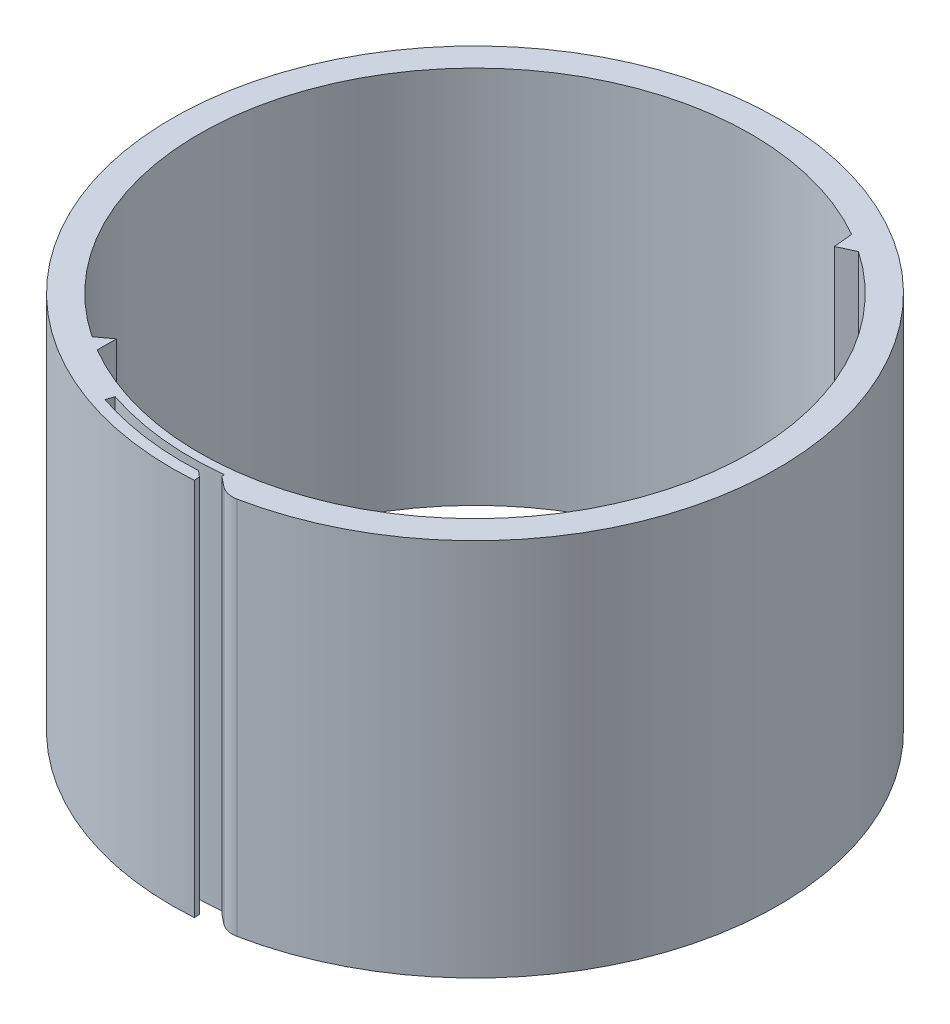
ISO-10303-21;
HEADER;
FILE_DESCRIPTION(('STEP AP214'),'2;1');
FILE_NAME('part.step','',(''),(''),'','','');
FILE_SCHEMA(('AUTOMOTIVE_DESIGN { 1 0 10303 214 1 1 1 1 }'));
ENDSEC;
DATA;
#1=APPLICATION_CONTEXT('core data for automotive mechanical design processes');
#2=APPLICATION_PROTOCOL_DEFINITION('international standard','automotive_design',2000,#1);
#3=PRODUCT_CONTEXT('',#1,'mechanical');
#4=PRODUCT('Part','Part','',(#3));
#5=PRODUCT_RELATED_PRODUCT_CATEGORY('part','',(#4));
#6=PRODUCT_DEFINITION_FORMATION('','',#4);
#7=PRODUCT_DEFINITION_CONTEXT('part definition',#1,'design');
#8=PRODUCT_DEFINITION('design','',#6,#7);
#9=PRODUCT_DEFINITION_SHAPE('','',#8);
#10=(LENGTH_UNIT() NAMED_UNIT(*) SI_UNIT(.MILLI.,.METRE.));
#11=(NAMED_UNIT(*) PLANE_ANGLE_UNIT() SI_UNIT($,.RADIAN.));
#12=(NAMED_UNIT(*) SI_UNIT($,.STERADIAN.) SOLID_ANGLE_UNIT());
#13=UNCERTAINTY_MEASURE_WITH_UNIT(LENGTH_MEASURE(1.E-05),#10,'distance_accuracy_value','');
#14=(GEOMETRIC_REPRESENTATION_CONTEXT(3) GLOBAL_UNCERTAINTY_ASSIGNED_CONTEXT((#13)) GLOBAL_UNIT_ASSIGNED_CONTEXT((#10,
#11,#12)) REPRESENTATION_CONTEXT('',''));
#15=CARTESIAN_POINT('',(0.,0.,0.));
#16=DIRECTION('',(0.,0.,1.));
#17=DIRECTION('',(1.,0.,0.));
#18=AXIS2_PLACEMENT_3D('',#15,#16,#17);
#19=CARTESIAN_POINT('',(29.4596511397249,30.6673096813294,30.0047862055106));
#20=DIRECTION('',(0.,1.,0.));
#21=DIRECTION('',(0.,0.,1.));
#22=AXIS2_PLACEMENT_3D('',#19,#20,#21);
#23=CYLINDRICAL_SURFACE('',#22,28.);
#24=CARTESIAN_POINT('',(29.4596511397249,65.6673096813294,30.0047862055106));
#25=DIRECTION('',(0.,-1.,0.));
#26=DIRECTION('',(0.,0.,-1.));
#27=AXIS2_PLACEMENT_3D('',#24,#25,#26);
#28=CIRCLE('',#27,28.);
#29=CARTESIAN_POINT('',(34.9473286613168,65.6673096813294,57.461759735363));
#30=VERTEX_POINT('',#29);
#31=CARTESIAN_POINT('',(31.4577931385277,65.6673096813294,57.9333992851575));
#32=VERTEX_POINT('',#31);
#33=EDGE_CURVE('E206',#30,#32,#28,.F.);
#34=ORIENTED_EDGE('',*,*,#33,.F.);
#35=DIRECTION('',(0.,1.,0.));
#36=VECTOR('',#35,1.);
#37=CARTESIAN_POINT('',(34.9473286613168,30.6673096813294,57.461759735363));
#38=LINE('',#37,#36);
#39=CARTESIAN_POINT('',(34.9473286613168,30.6673096813294,57.461759735363));
#40=VERTEX_POINT('',#39);
#41=EDGE_CURVE('E248',#30,#40,#38,.F.);
#42=ORIENTED_EDGE('',*,*,#41,.T.);
#43=CARTESIAN_POINT('',(29.4596511397249,30.6673096813294,30.0047862055106));
#44=DIRECTION('',(0.,-1.,0.));
#45=DIRECTION('',(0.,0.,-1.));
#46=AXIS2_PLACEMENT_3D('',#43,#44,#45);
#47=CIRCLE('',#46,28.);
#48=CARTESIAN_POINT('',(31.4577931385277,30.6673096813294,57.9333992851575));
#49=VERTEX_POINT('',#48);
#50=EDGE_CURVE('E174',#40,#49,#47,.F.);
#51=ORIENTED_EDGE('',*,*,#50,.T.);
#52=DIRECTION('',(0.,1.,0.));
#53=VECTOR('',#52,1.);
#54=CARTESIAN_POINT('',(31.4577931385277,30.6673096813294,57.9333992851575));
#55=LINE('',#54,#53);
#56=EDGE_CURVE('E162',#49,#32,#55,.T.);
#57=ORIENTED_EDGE('',*,*,#56,.T.);
#58=EDGE_LOOP('',(#34,#42,#51,#57));
#59=FACE_BOUND('',#58,.T.);
#60=ADVANCED_FACE('F35',(#59),#23,.T.);
#61=CARTESIAN_POINT('',(25.7842829800759,30.6673096813294,-2.88163696582693));
#62=DIRECTION('',(0.993812813364655,0.,-0.111067961141947));
#63=DIRECTION('',(-0.111067961141947,0.,-0.993812813364655));
#64=AXIS2_PLACEMENT_3D('',#61,#62,#63);
#65=PLANE('',#64);
#66=DIRECTION('',(-0.111067961141947,0.,-0.993812813364655));
#67=VECTOR('',#66,1.);
#68=CARTESIAN_POINT('',(25.7842829800759,30.6673096813294,-2.88163696582693));
#69=LINE('',#68,#67);
#70=CARTESIAN_POINT('',(32.4029521099866,30.6673096813294,56.3408257596739));
#71=VERTEX_POINT('',#70);
#72=CARTESIAN_POINT('',(32.37598766456,30.6673096813294,56.0995535593494));
#73=VERTEX_POINT('',#72);
#74=EDGE_CURVE('E182',#71,#73,#69,.T.);
#75=ORIENTED_EDGE('',*,*,#74,.F.);
#76=DIRECTION('',(0.,1.,0.));
#77=VECTOR('',#76,1.);
#78=CARTESIAN_POINT('',(32.4029521099866,65.6673096813294,56.340825759674));
#79=LINE('',#78,#77);
#80=CARTESIAN_POINT('',(32.4029521099866,65.6673096813294,56.3408257596739));
#81=VERTEX_POINT('',#80);
#82=EDGE_CURVE('E231',#71,#81,#79,.T.);
#83=ORIENTED_EDGE('',*,*,#82,.T.);
#84=DIRECTION('',(-0.111067961141947,0.,-0.993812813364655));
#85=VECTOR('',#84,1.);
#86=CARTESIAN_POINT('',(25.7842829800759,65.6673096813294,-2.88163696582693));
#87=LINE('',#86,#85);
#88=CARTESIAN_POINT('',(32.37598766456,65.6673096813294,56.0995535593494));
#89=VERTEX_POINT('',#88);
#90=EDGE_CURVE('E209',#81,#89,#87,.T.);
#91=ORIENTED_EDGE('',*,*,#90,.T.);
#92=DIRECTION('',(0.,1.,0.));
#93=VECTOR('',#92,1.);
#94=CARTESIAN_POINT('',(32.37598766456,30.6673096813294,56.0995535593494));
#95=LINE('',#94,#93);
#96=EDGE_CURVE('E228',#73,#89,#95,.T.);
#97=ORIENTED_EDGE('',*,*,#96,.F.);
#98=EDGE_LOOP('',(#75,#83,#91,#97));
#99=FACE_BOUND('',#98,.T.);
#100=ADVANCED_FACE('F282',(#99),#65,.F.);
#101=CARTESIAN_POINT('',(29.459651139725,30.6673096813294,30.0047862055106));
#102=DIRECTION('',(0.,1.,0.));
#103=DIRECTION('',(0.,0.,1.));
#104=AXIS2_PLACEMENT_3D('',#101,#102,#103);
#105=CYLINDRICAL_SURFACE('',#104,26.2572257098319);
#106=CARTESIAN_POINT('',(29.459651139725,65.6673096813294,30.0047862055106));
#107=DIRECTION('',(0.,-1.,0.));
#108=DIRECTION('',(0.,0.,-1.));
#109=AXIS2_PLACEMENT_3D('',#106,#107,#108);
#110=CIRCLE('',#109,26.2572257098319);
#111=CARTESIAN_POINT('',(21.1004312854229,65.6673096813294,54.8958557969223));
#112=VERTEX_POINT('',#111);
#113=EDGE_CURVE('E211',#89,#112,#110,.T.);
#114=ORIENTED_EDGE('',*,*,#113,.T.);
#115=DIRECTION('',(0.,1.,0.));
#116=VECTOR('',#115,1.);
#117=CARTESIAN_POINT('',(21.1004312854229,30.6673096813294,54.8958557969223));
#118=LINE('',#117,#116);
#119=CARTESIAN_POINT('',(21.1004312854229,30.6673096813294,54.8958557969223));
#120=VERTEX_POINT('',#119);
#121=EDGE_CURVE('E225',#120,#112,#118,.T.);
#122=ORIENTED_EDGE('',*,*,#121,.F.);
#123=CARTESIAN_POINT('',(29.459651139725,30.6673096813294,30.0047862055106));
#124=DIRECTION('',(0.,-1.,0.));
#125=DIRECTION('',(0.,0.,-1.));
#126=AXIS2_PLACEMENT_3D('',#123,#124,#125);
#127=CIRCLE('',#126,26.2572257098319);
#128=EDGE_CURVE('E184',#73,#120,#127,.T.);
#129=ORIENTED_EDGE('',*,*,#128,.F.);
#130=ORIENTED_EDGE('',*,*,#96,.T.);
#131=EDGE_LOOP('',(#114,#122,#129,#130));
#132=FACE_BOUND('',#131,.T.);
#133=ADVANCED_FACE('F287',(#132),#105,.T.);
#134=CARTESIAN_POINT('',(35.5291322194802,30.6673096813294,11.9318226307832));
#135=DIRECTION('',(-0.947970279361665,0.,-0.318358837551223));
#136=DIRECTION('',(-0.318358837551224,0.,0.947970279361665));
#137=AXIS2_PLACEMENT_3D('',#134,#135,#136);
#138=PLANE('',#137);
#139=DIRECTION('',(-0.318358837551223,0.,0.947970279361665));
#140=VECTOR('',#139,1.);
#141=CARTESIAN_POINT('',(35.5291322194802,65.6673096813294,11.9318226307832));
#142=LINE('',#141,#140);
#143=CARTESIAN_POINT('',(20.8639625258459,65.6673096813294,55.599983748264));
#144=VERTEX_POINT('',#143);
#145=EDGE_CURVE('E214',#112,#144,#142,.T.);
#146=ORIENTED_EDGE('',*,*,#145,.T.);
#147=DIRECTION('',(0.,1.,0.));
#148=VECTOR('',#147,1.);
#149=CARTESIAN_POINT('',(20.8639625258459,30.6673096813294,55.599983748264));
#150=LINE('',#149,#148);
#151=CARTESIAN_POINT('',(20.8639625258459,30.6673096813294,55.599983748264));
#152=VERTEX_POINT('',#151);
#153=EDGE_CURVE('E222',#152,#144,#150,.T.);
#154=ORIENTED_EDGE('',*,*,#153,.F.);
#155=DIRECTION('',(-0.318358837551223,0.,0.947970279361665));
#156=VECTOR('',#155,1.);
#157=CARTESIAN_POINT('',(35.5291322194802,30.6673096813294,11.9318226307832));
#158=LINE('',#157,#156);
#159=EDGE_CURVE('E187',#120,#152,#158,.T.);
#160=ORIENTED_EDGE('',*,*,#159,.F.);
#161=ORIENTED_EDGE('',*,*,#121,.T.);
#162=EDGE_LOOP('',(#146,#154,#160,#161));
#163=FACE_BOUND('',#162,.T.);
#164=ADVANCED_FACE('F328',(#163),#138,.F.);
#165=CARTESIAN_POINT('',(29.4596511397789,30.6673096813294,30.0047862053341));
#166=DIRECTION('',(0.,1.,0.));
#167=DIRECTION('',(0.,0.,1.));
#168=AXIS2_PLACEMENT_3D('',#165,#166,#167);
#169=CYLINDRICAL_SURFACE('',#168,27.0000000001722);
#170=CARTESIAN_POINT('',(29.4596511397789,65.6673096813294,30.0047862053341));
#171=DIRECTION('',(0.,-1.,0.));
#172=DIRECTION('',(0.,0.,-1.));
#173=AXIS2_PLACEMENT_3D('',#170,#171,#172);
#174=CIRCLE('',#173,27.0000000001722);
#175=CARTESIAN_POINT('',(30.8826632237525,65.6673096813294,56.9672608064935));
#176=VERTEX_POINT('',#175);
#177=EDGE_CURVE('E217',#176,#144,#174,.T.);
#178=ORIENTED_EDGE('',*,*,#177,.F.);
#179=DIRECTION('',(0.,1.,0.));
#180=VECTOR('',#179,1.);
#181=CARTESIAN_POINT('',(30.8826632237525,30.6673096813294,56.9672608064935));
#182=LINE('',#181,#180);
#183=CARTESIAN_POINT('',(30.8826632237525,30.6673096813294,56.9672608064935));
#184=VERTEX_POINT('',#183);
#185=EDGE_CURVE('E43',#176,#184,#182,.F.);
#186=ORIENTED_EDGE('',*,*,#185,.T.);
#187=CARTESIAN_POINT('',(29.4596511397789,30.6673096813294,30.0047862053341));
#188=DIRECTION('',(0.,-1.,0.));
#189=DIRECTION('',(0.,0.,-1.));
#190=AXIS2_PLACEMENT_3D('',#187,#188,#189);
#191=CIRCLE('',#190,27.0000000001722);
#192=EDGE_CURVE('E190',#184,#152,#191,.T.);
#193=ORIENTED_EDGE('',*,*,#192,.T.);
#194=ORIENTED_EDGE('',*,*,#153,.T.);
#195=EDGE_LOOP('',(#178,#186,#193,#194));
#196=FACE_BOUND('',#195,.T.);
#197=ADVANCED_FACE('F309',(#196),#169,.F.);
#198=CARTESIAN_POINT('',(41.0350256014031,30.6673096813294,-3.87694089565386));
#199=DIRECTION('',(0.995566534737039,0.,-0.0940599538150268));
#200=DIRECTION('',(-0.0940599538150268,0.,-0.995566534737039));
#201=AXIS2_PLACEMENT_3D('',#198,#199,#200);
#202=PLANE('',#201);
#203=DIRECTION('',(-0.0940599538150268,0.,-0.995566534737039));
#204=VECTOR('',#203,1.);
#205=CARTESIAN_POINT('',(41.0350256014031,65.6673096813294,-3.87694089565386));
#206=LINE('',#205,#204);
#207=CARTESIAN_POINT('',(42.3128723569037,65.6673096813294,9.64827801738607));
#208=VERTEX_POINT('',#207);
#209=CARTESIAN_POINT('',(42.1462471673126,65.6673096813294,7.88465326665151));
#210=VERTEX_POINT('',#209);
#211=EDGE_CURVE('E158',#208,#210,#206,.T.);
#212=ORIENTED_EDGE('',*,*,#211,.T.);
#213=DIRECTION('',(0.,1.,0.));
#214=VECTOR('',#213,1.);
#215=CARTESIAN_POINT('',(42.1462471673126,30.6673096813294,7.88465326665151));
#216=LINE('',#215,#214);
#217=CARTESIAN_POINT('',(42.1462471673126,30.6673096813294,7.88465326665151));
#218=VERTEX_POINT('',#217);
#219=EDGE_CURVE('E155',#218,#210,#216,.T.);
#220=ORIENTED_EDGE('',*,*,#219,.F.);
#221=DIRECTION('',(-0.0940599538150268,0.,-0.995566534737039));
#222=VECTOR('',#221,1.);
#223=CARTESIAN_POINT('',(41.0350256014031,30.6673096813294,-3.87694089565386));
#224=LINE('',#223,#222);
#225=CARTESIAN_POINT('',(42.3128723569037,30.6673096813294,9.64827801738607));
#226=VERTEX_POINT('',#225);
#227=EDGE_CURVE('E140',#226,#218,#224,.T.);
#228=ORIENTED_EDGE('',*,*,#227,.F.);
#229=DIRECTION('',(0.,1.,0.));
#230=VECTOR('',#229,1.);
#231=CARTESIAN_POINT('',(42.3128723569037,30.6673096813294,9.64827801738607));
#232=LINE('',#231,#230);
#233=EDGE_CURVE('E194',#226,#208,#232,.T.);
#234=ORIENTED_EDGE('',*,*,#233,.T.);
#235=EDGE_LOOP('',(#212,#220,#228,#234));
#236=FACE_BOUND('',#235,.T.);
#237=ADVANCED_FACE('F156',(#236),#202,.F.);
#238=CARTESIAN_POINT('',(29.459651139725,30.6673096813294,30.0047862055106));
#239=DIRECTION('',(0.,1.,0.));
#240=DIRECTION('',(0.,0.,1.));
#241=AXIS2_PLACEMENT_3D('',#238,#239,#240);
#242=CYLINDRICAL_SURFACE('',#241,25.5);
#243=CARTESIAN_POINT('',(29.459651139725,65.6673096813294,30.0047862055106));
#244=DIRECTION('',(0.,-1.,0.));
#245=DIRECTION('',(0.,0.,-1.));
#246=AXIS2_PLACEMENT_3D('',#243,#244,#245);
#247=CIRCLE('',#246,25.5);
#248=CARTESIAN_POINT('',(15.2362693222129,65.6673096813294,51.1695070794854));
#249=VERTEX_POINT('',#248);
#250=EDGE_CURVE('E196',#249,#210,#247,.T.);
#251=ORIENTED_EDGE('',*,*,#250,.F.);
#252=DIRECTION('',(0.,1.,0.));
#253=VECTOR('',#252,1.);
#254=CARTESIAN_POINT('',(15.2362693222129,30.6673096813294,51.1695070794854));
#255=LINE('',#254,#253);
#256=CARTESIAN_POINT('',(15.2362693222129,30.6673096813294,51.1695070794854));
#257=VERTEX_POINT('',#256);
#258=EDGE_CURVE('E163',#257,#249,#255,.T.);
#259=ORIENTED_EDGE('',*,*,#258,.F.);
#260=CARTESIAN_POINT('',(29.459651139725,30.6673096813294,30.0047862055106));
#261=DIRECTION('',(0.,-1.,0.));
#262=DIRECTION('',(0.,0.,-1.));
#263=AXIS2_PLACEMENT_3D('',#260,#261,#262);
#264=CIRCLE('',#263,25.5);
#265=EDGE_CURVE('E145',#257,#218,#264,.T.);
#266=ORIENTED_EDGE('',*,*,#265,.T.);
#267=ORIENTED_EDGE('',*,*,#219,.T.);
#268=EDGE_LOOP('',(#251,#259,#266,#267));
#269=FACE_BOUND('',#268,.T.);
#270=ADVANCED_FACE('F165',(#269),#242,.F.);
#271=CARTESIAN_POINT('',(29.6986021478867,30.6673096813294,40.5870381980663));
#272=DIRECTION('',(0.59051995722891,0.,0.807023035677648));
#273=DIRECTION('',(0.807023035677648,0.,-0.59051995722891));
#274=AXIS2_PLACEMENT_3D('',#271,#272,#273);
#275=PLANE('',#274);
#276=DIRECTION('',(0.807023035677648,0.,-0.59051995722891));
#277=VECTOR('',#276,1.);
#278=CARTESIAN_POINT('',(29.6986021478867,65.6673096813294,40.5870381980663));
#279=LINE('',#278,#277);
#280=CARTESIAN_POINT('',(16.5342349189292,65.6673096813294,50.2197515523537));
#281=VERTEX_POINT('',#280);
#282=EDGE_CURVE('E198',#249,#281,#279,.T.);
#283=ORIENTED_EDGE('',*,*,#282,.T.);
#284=DIRECTION('',(0.,1.,0.));
#285=VECTOR('',#284,1.);
#286=CARTESIAN_POINT('',(16.5342349189292,30.6673096813294,50.2197515523537));
#287=LINE('',#286,#285);
#288=CARTESIAN_POINT('',(16.5342349189292,30.6673096813294,50.2197515523537));
#289=VERTEX_POINT('',#288);
#290=EDGE_CURVE('E237',#289,#281,#287,.T.);
#291=ORIENTED_EDGE('',*,*,#290,.F.);
#292=DIRECTION('',(0.807023035677648,0.,-0.59051995722891));
#293=VECTOR('',#292,1.);
#294=CARTESIAN_POINT('',(29.6986021478867,30.6673096813294,40.5870381980663));
#295=LINE('',#294,#293);
#296=EDGE_CURVE('E167',#257,#289,#295,.T.);
#297=ORIENTED_EDGE('',*,*,#296,.F.);
#298=ORIENTED_EDGE('',*,*,#258,.T.);
#299=EDGE_LOOP('',(#283,#291,#297,#298));
#300=FACE_BOUND('',#299,.T.);
#301=ADVANCED_FACE('F302',(#300),#275,.F.);
#302=CARTESIAN_POINT('',(16.5342349189292,30.6673096813294,0.));
#303=DIRECTION('',(-1.,0.,0.));
#304=DIRECTION('',(0.,-1.,0.));
#305=AXIS2_PLACEMENT_3D('',#302,#303,#304);
#306=PLANE('',#305);
#307=DIRECTION('',(0.,0.,1.));
#308=VECTOR('',#307,1.);
#309=CARTESIAN_POINT('',(16.5342349189292,65.6673096813294,0.));
#310=LINE('',#309,#308);
#311=CARTESIAN_POINT('',(16.5342349189292,65.6673096813294,51.9862241821123));
#312=VERTEX_POINT('',#311);
#313=EDGE_CURVE('E201',#281,#312,#310,.T.);
#314=ORIENTED_EDGE('',*,*,#313,.T.);
#315=DIRECTION('',(0.,1.,0.));
#316=VECTOR('',#315,1.);
#317=CARTESIAN_POINT('',(16.5342349189292,30.6673096813294,51.9862241821123));
#318=LINE('',#317,#316);
#319=CARTESIAN_POINT('',(16.5342349189292,30.6673096813294,51.9862241821123));
#320=VERTEX_POINT('',#319);
#321=EDGE_CURVE('E235',#320,#312,#318,.T.);
#322=ORIENTED_EDGE('',*,*,#321,.F.);
#323=DIRECTION('',(0.,0.,1.));
#324=VECTOR('',#323,1.);
#325=CARTESIAN_POINT('',(16.5342349189292,30.6673096813294,0.));
#326=LINE('',#325,#324);
#327=EDGE_CURVE('E170',#289,#320,#326,.T.);
#328=ORIENTED_EDGE('',*,*,#327,.F.);
#329=ORIENTED_EDGE('',*,*,#290,.T.);
#330=EDGE_LOOP('',(#314,#322,#328,#329));
#331=FACE_BOUND('',#330,.T.);
#332=ADVANCED_FACE('F299',(#331),#306,.F.);
#333=CARTESIAN_POINT('',(43.8369653323931,65.6673096813294,8.944329500935));
#334=VERTEX_POINT('',#333);
#335=EDGE_CURVE('E199',#334,#312,#247,.T.);
#336=ORIENTED_EDGE('',*,*,#335,.F.);
#337=DIRECTION('',(0.,1.,0.));
#338=VECTOR('',#337,1.);
#339=CARTESIAN_POINT('',(43.8369653323931,30.6673096813294,8.944329500935));
#340=LINE('',#339,#338);
#341=CARTESIAN_POINT('',(43.8369653323931,30.6673096813294,8.944329500935));
#342=VERTEX_POINT('',#341);
#343=EDGE_CURVE('E233',#342,#334,#340,.T.);
#344=ORIENTED_EDGE('',*,*,#343,.F.);
#345=EDGE_CURVE('E169',#342,#320,#264,.T.);
#346=ORIENTED_EDGE('',*,*,#345,.T.);
#347=ORIENTED_EDGE('',*,*,#321,.T.);
#348=EDGE_LOOP('',(#336,#344,#346,#347));
#349=FACE_BOUND('',#348,.T.);
#350=ADVANCED_FACE('F295',(#349),#242,.F.);
#351=CARTESIAN_POINT('',(11.1124433894804,30.6673096813294,24.0591414210451));
#352=DIRECTION('',(-0.419313995915413,0.,-0.907841270723825));
#353=DIRECTION('',(-0.907841270723825,0.,0.419313995915413));
#354=AXIS2_PLACEMENT_3D('',#351,#352,#353);
#355=PLANE('',#354);
#356=DIRECTION('',(-0.907841270723825,0.,0.419313995915413));
#357=VECTOR('',#356,1.);
#358=CARTESIAN_POINT('',(11.1124433894804,65.6673096813294,24.0591414210451));
#359=LINE('',#358,#357);
#360=EDGE_CURVE('E204',#334,#208,#359,.T.);
#361=ORIENTED_EDGE('',*,*,#360,.T.);
#362=ORIENTED_EDGE('',*,*,#233,.F.);
#363=DIRECTION('',(-0.907841270723825,0.,0.419313995915413));
#364=VECTOR('',#363,1.);
#365=CARTESIAN_POINT('',(11.1124433894804,30.6673096813294,24.0591414210451));
#366=LINE('',#365,#364);
#367=EDGE_CURVE('E148',#342,#226,#366,.T.);
#368=ORIENTED_EDGE('',*,*,#367,.F.);
#369=ORIENTED_EDGE('',*,*,#343,.T.);
#370=EDGE_LOOP('',(#361,#362,#368,#369));
#371=FACE_BOUND('',#370,.T.);
#372=ADVANCED_FACE('F292',(#371),#355,.F.);
#373=CARTESIAN_POINT('',(27.1738770317229,30.6673096813294,-1.94414469535389));
#374=DIRECTION('',(-0.997450467130244,0.,0.0713622142429549));
#375=DIRECTION('',(0.0713622142429549,0.,0.997450467130244));
#376=AXIS2_PLACEMENT_3D('',#373,#374,#375);
#377=PLANE('',#376);
#378=DIRECTION('',(0.0713622142429549,0.,0.997450467130244));
#379=VECTOR('',#378,1.);
#380=CARTESIAN_POINT('',(27.1738770317229,30.6673096813294,-1.94414469535389));
#381=LINE('',#380,#379);
#382=CARTESIAN_POINT('',(31.4221120314063,30.6673096813294,57.4346740515936));
#383=VERTEX_POINT('',#382);
#384=EDGE_CURVE('E192',#383,#49,#381,.T.);
#385=ORIENTED_EDGE('',*,*,#384,.F.);
#386=DIRECTION('',(0.,1.,0.));
#387=VECTOR('',#386,1.);
#388=CARTESIAN_POINT('',(31.4221120314063,65.6673096813294,57.4346740515936));
#389=LINE('',#388,#387);
#390=CARTESIAN_POINT('',(31.4221120314063,65.6673096813294,57.4346740515936));
#391=VERTEX_POINT('',#390);
#392=EDGE_CURVE('E257',#383,#391,#389,.T.);
#393=ORIENTED_EDGE('',*,*,#392,.T.);
#394=DIRECTION('',(0.0713622142429549,0.,0.997450467130244));
#395=VECTOR('',#394,1.);
#396=CARTESIAN_POINT('',(27.1738770317229,65.6673096813294,-1.94414469535389));
#397=LINE('',#396,#395);
#398=EDGE_CURVE('E152',#391,#32,#397,.T.);
#399=ORIENTED_EDGE('',*,*,#398,.T.);
#400=ORIENTED_EDGE('',*,*,#56,.F.);
#401=EDGE_LOOP('',(#385,#393,#399,#400));
#402=FACE_BOUND('',#401,.T.);
#403=ADVANCED_FACE('F263',(#402),#377,.F.);
#404=CARTESIAN_POINT('',(0.,30.6673096813294,0.));
#405=DIRECTION('',(0.,-1.,0.));
#406=DIRECTION('',(0.,0.,-1.));
#407=AXIS2_PLACEMENT_3D('',#404,#405,#406);
#408=PLANE('',#407);
#409=ORIENTED_EDGE('',*,*,#227,.T.);
#410=ORIENTED_EDGE('',*,*,#265,.F.);
#411=ORIENTED_EDGE('',*,*,#296,.T.);
#412=ORIENTED_EDGE('',*,*,#327,.T.);
#413=ORIENTED_EDGE('',*,*,#345,.F.);
#414=ORIENTED_EDGE('',*,*,#367,.T.);
#415=EDGE_LOOP('',(#409,#410,#411,#412,#413,#414));
#416=FACE_BOUND('',#415,.T.);
#417=ORIENTED_EDGE('',*,*,#192,.F.);
#418=DIRECTION('',(-0.755764694815564,0.,-0.654843283595654));
#419=VECTOR('',#418,1.);
#420=CARTESIAN_POINT('',(-14.9504257053914,30.6673096813294,17.254516009627));
#421=LINE('',#420,#419);
#422=EDGE_CURVE('E11',#184,#383,#421,.F.);
#423=ORIENTED_EDGE('',*,*,#422,.T.);
#424=ORIENTED_EDGE('',*,*,#384,.T.);
#425=ORIENTED_EDGE('',*,*,#50,.F.);
#426=CARTESIAN_POINT('',(34.5553516954889,30.6673096813294,55.5005473403735));
#427=DIRECTION('',(0.,-1.,0.));
#428=DIRECTION('',(0.,0.,-1.));
#429=AXIS2_PLACEMENT_3D('',#426,#427,#428);
#430=CIRCLE('',#429,2.);
#431=CARTESIAN_POINT('',(33.3069619533605,30.6673096813294,57.0630847164861));
#432=VERTEX_POINT('',#431);
#433=EDGE_CURVE('E251',#40,#432,#430,.T.);
#434=ORIENTED_EDGE('',*,*,#433,.T.);
#435=DIRECTION('',(0.781268688056263,0.,0.624194871064194));
#436=VECTOR('',#435,1.);
#437=CARTESIAN_POINT('',(-14.8505737906706,30.6673096813294,18.5876059547543));
#438=LINE('',#437,#436);
#439=EDGE_CURVE('E246',#432,#71,#438,.F.);
#440=ORIENTED_EDGE('',*,*,#439,.T.);
#441=ORIENTED_EDGE('',*,*,#74,.T.);
#442=ORIENTED_EDGE('',*,*,#128,.T.);
#443=ORIENTED_EDGE('',*,*,#159,.T.);
#444=EDGE_LOOP('',(#417,#423,#424,#425,#434,#440,#441,#442,#443));
#445=FACE_BOUND('',#444,.T.);
#446=ADVANCED_FACE('F142',(#416,#445),#408,.T.);
#447=CARTESIAN_POINT('',(0.,65.6673096813294,0.));
#448=DIRECTION('',(0.,-1.,0.));
#449=DIRECTION('',(0.,0.,-1.));
#450=AXIS2_PLACEMENT_3D('',#447,#448,#449);
#451=PLANE('',#450);
#452=ORIENTED_EDGE('',*,*,#211,.F.);
#453=ORIENTED_EDGE('',*,*,#360,.F.);
#454=ORIENTED_EDGE('',*,*,#335,.T.);
#455=ORIENTED_EDGE('',*,*,#313,.F.);
#456=ORIENTED_EDGE('',*,*,#282,.F.);
#457=ORIENTED_EDGE('',*,*,#250,.T.);
#458=EDGE_LOOP('',(#452,#453,#454,#455,#456,#457));
#459=FACE_BOUND('',#458,.T.);
#460=ORIENTED_EDGE('',*,*,#398,.F.);
#461=DIRECTION('',(0.755764694815564,0.,0.654843283595654));
#462=VECTOR('',#461,1.);
#463=CARTESIAN_POINT('',(31.4221120314063,65.6673096813294,57.4346740515936));
#464=LINE('',#463,#462);
#465=EDGE_CURVE('E57',#391,#176,#464,.F.);
#466=ORIENTED_EDGE('',*,*,#465,.T.);
#467=ORIENTED_EDGE('',*,*,#177,.T.);
#468=ORIENTED_EDGE('',*,*,#145,.F.);
#469=ORIENTED_EDGE('',*,*,#113,.F.);
#470=ORIENTED_EDGE('',*,*,#90,.F.);
#471=DIRECTION('',(-0.781268688056263,0.,-0.624194871064194));
#472=VECTOR('',#471,1.);
#473=CARTESIAN_POINT('',(32.4029521099866,65.6673096813294,56.340825759674));
#474=LINE('',#473,#472);
#475=CARTESIAN_POINT('',(33.3069619533605,65.6673096813294,57.0630847164861));
#476=VERTEX_POINT('',#475);
#477=EDGE_CURVE('E243',#81,#476,#474,.F.);
#478=ORIENTED_EDGE('',*,*,#477,.T.);
#479=CARTESIAN_POINT('',(34.5553516954889,65.6673096813294,55.5005473403735));
#480=DIRECTION('',(0.,-1.,0.));
#481=DIRECTION('',(0.,0.,-1.));
#482=AXIS2_PLACEMENT_3D('',#479,#480,#481);
#483=CIRCLE('',#482,2.);
#484=EDGE_CURVE('E255',#476,#30,#483,.F.);
#485=ORIENTED_EDGE('',*,*,#484,.T.);
#486=ORIENTED_EDGE('',*,*,#33,.T.);
#487=EDGE_LOOP('',(#460,#466,#467,#468,#469,#470,#478,#485,#486));
#488=FACE_BOUND('',#487,.T.);
#489=ADVANCED_FACE('F267',(#459,#488),#451,.F.);
#490=CARTESIAN_POINT('',(32.4029521099866,30.6673096813294,56.340825759674));
#491=DIRECTION('',(0.624194871064194,0.,-0.781268688056263));
#492=DIRECTION('',(0.,1.,0.));
#493=AXIS2_PLACEMENT_3D('',#490,#491,#492);
#494=PLANE('',#493);
#495=ORIENTED_EDGE('',*,*,#439,.F.);
#496=DIRECTION('',(0.,-1.,0.));
#497=VECTOR('',#496,1.);
#498=CARTESIAN_POINT('',(33.3069619533605,30.6673096813294,57.0630847164861));
#499=LINE('',#498,#497);
#500=EDGE_CURVE('E253',#432,#476,#499,.F.);
#501=ORIENTED_EDGE('',*,*,#500,.T.);
#502=ORIENTED_EDGE('',*,*,#477,.F.);
#503=ORIENTED_EDGE('',*,*,#82,.F.);
#504=EDGE_LOOP('',(#495,#501,#502,#503));
#505=FACE_BOUND('',#504,.T.);
#506=ADVANCED_FACE('F279',(#505),#494,.F.);
#507=CARTESIAN_POINT('',(34.5553516954889,30.6673096813294,55.5005473403735));
#508=DIRECTION('',(0.,1.,0.));
#509=DIRECTION('',(0.,0.,1.));
#510=AXIS2_PLACEMENT_3D('',#507,#508,#509);
#511=CYLINDRICAL_SURFACE('',#510,2.);
#512=ORIENTED_EDGE('',*,*,#484,.F.);
#513=ORIENTED_EDGE('',*,*,#500,.F.);
#514=ORIENTED_EDGE('',*,*,#433,.F.);
#515=ORIENTED_EDGE('',*,*,#41,.F.);
#516=EDGE_LOOP('',(#512,#513,#514,#515));
#517=FACE_BOUND('',#516,.T.);
#518=ADVANCED_FACE('F275',(#517),#511,.T.);
#519=CARTESIAN_POINT('',(31.4221120314063,30.6673096813294,57.4346740515936));
#520=DIRECTION('',(-0.654843283595654,0.,0.755764694815564));
#521=DIRECTION('',(0.,1.,0.));
#522=AXIS2_PLACEMENT_3D('',#519,#520,#521);
#523=PLANE('',#522);
#524=ORIENTED_EDGE('',*,*,#422,.F.);
#525=ORIENTED_EDGE('',*,*,#185,.F.);
#526=ORIENTED_EDGE('',*,*,#465,.F.);
#527=ORIENTED_EDGE('',*,*,#392,.F.);
#528=EDGE_LOOP('',(#524,#525,#526,#527));
#529=FACE_BOUND('',#528,.T.);
#530=ADVANCED_FACE('F37',(#529),#523,.F.);
#531=CLOSED_SHELL('',(#60,#100,#133,#164,#197,#237,#270,#301,#332,#350,#372,#403,#446,#489,#506,
#518,#530));
#532=MANIFOLD_SOLID_BREP('B2',#531);
#533=ADVANCED_BREP_SHAPE_REPRESENTATION('',(#18,#532),#14);
#534=SHAPE_DEFINITION_REPRESENTATION(#9,#533);
ENDSEC;
END-ISO-10303-21;
